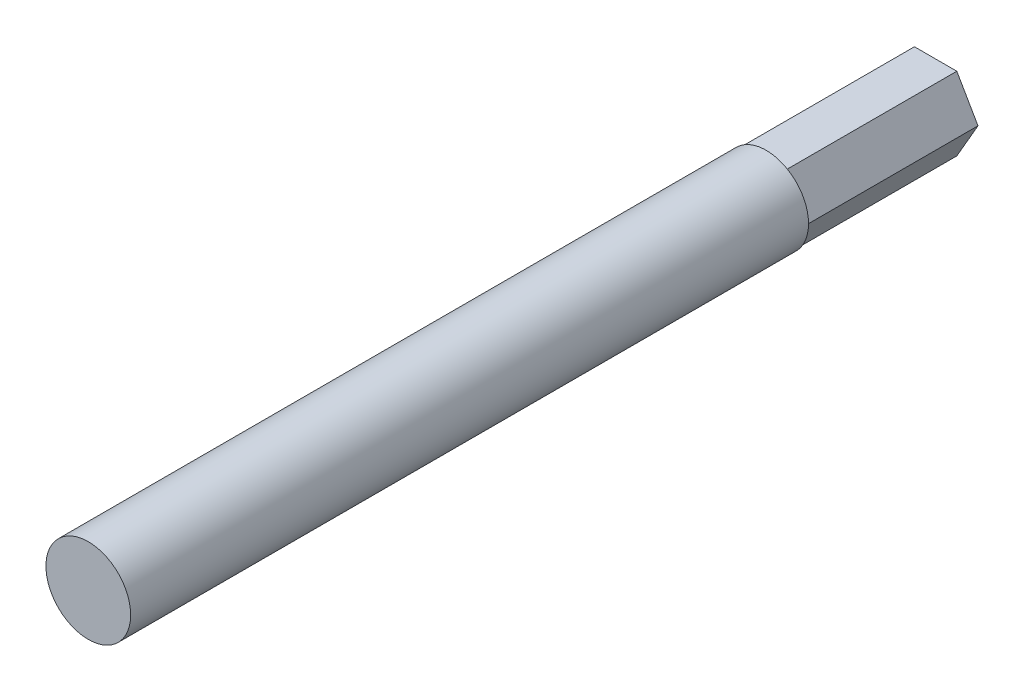
ISO-10303-21;
HEADER;
FILE_DESCRIPTION(('STEP AP214'),'2;1');
FILE_NAME('part.step','',(''),(''),'','','');
FILE_SCHEMA(('AUTOMOTIVE_DESIGN { 1 0 10303 214 1 1 1 1 }'));
ENDSEC;
DATA;
#1=APPLICATION_CONTEXT('core data for automotive mechanical design processes');
#2=APPLICATION_PROTOCOL_DEFINITION('international standard','automotive_design',2000,#1);
#3=PRODUCT_CONTEXT('',#1,'mechanical');
#4=PRODUCT('Part','Part','',(#3));
#5=PRODUCT_RELATED_PRODUCT_CATEGORY('part','',(#4));
#6=PRODUCT_DEFINITION_FORMATION('','',#4);
#7=PRODUCT_DEFINITION_CONTEXT('part definition',#1,'design');
#8=PRODUCT_DEFINITION('design','',#6,#7);
#9=PRODUCT_DEFINITION_SHAPE('','',#8);
#10=(LENGTH_UNIT() NAMED_UNIT(*) SI_UNIT(.MILLI.,.METRE.));
#11=(NAMED_UNIT(*) PLANE_ANGLE_UNIT() SI_UNIT($,.RADIAN.));
#12=(NAMED_UNIT(*) SI_UNIT($,.STERADIAN.) SOLID_ANGLE_UNIT());
#13=UNCERTAINTY_MEASURE_WITH_UNIT(LENGTH_MEASURE(1.E-05),#10,'distance_accuracy_value','');
#14=(GEOMETRIC_REPRESENTATION_CONTEXT(3) GLOBAL_UNCERTAINTY_ASSIGNED_CONTEXT((#13)) GLOBAL_UNIT_ASSIGNED_CONTEXT((#10,
#11,#12)) REPRESENTATION_CONTEXT('',''));
#15=CARTESIAN_POINT('',(0.,0.,0.));
#16=DIRECTION('',(0.,0.,1.));
#17=DIRECTION('',(1.,0.,0.));
#18=AXIS2_PLACEMENT_3D('',#15,#16,#17);
#19=CARTESIAN_POINT('',(0.,0.,-63.5));
#20=DIRECTION('',(0.,0.,1.));
#21=DIRECTION('',(1.,0.,0.));
#22=AXIS2_PLACEMENT_3D('',#19,#20,#21);
#23=CYLINDRICAL_SURFACE('',#22,6.35);
#24=CARTESIAN_POINT('',(0.,0.,63.5));
#25=DIRECTION('',(0.,0.,1.));
#26=DIRECTION('',(1.,0.,0.));
#27=AXIS2_PLACEMENT_3D('',#24,#25,#26);
#28=CIRCLE('',#27,6.35);
#29=CARTESIAN_POINT('',(6.35,0.,63.5));
#30=VERTEX_POINT('',#29);
#31=EDGE_CURVE('E11',#30,#30,#28,.T.);
#32=ORIENTED_EDGE('',*,*,#31,.F.);
#33=EDGE_LOOP('',(#32));
#34=FACE_BOUND('',#33,.T.);
#35=CARTESIAN_POINT('',(0.,0.,-38.1));
#36=DIRECTION('',(0.,0.,-1.));
#37=DIRECTION('',(-1.,0.,0.));
#38=AXIS2_PLACEMENT_3D('',#35,#36,#37);
#39=CIRCLE('',#38,6.35);
#40=CARTESIAN_POINT('',(6.35,0.,-38.1));
#41=VERTEX_POINT('',#40);
#42=CARTESIAN_POINT('',(3.175,-5.49926131403118,-38.1));
#43=VERTEX_POINT('',#42);
#44=EDGE_CURVE('E116',#41,#43,#39,.T.);
#45=ORIENTED_EDGE('',*,*,#44,.F.);
#46=CARTESIAN_POINT('',(0.,0.,-38.1));
#47=DIRECTION('',(0.,0.,-1.));
#48=DIRECTION('',(-1.,0.,0.));
#49=AXIS2_PLACEMENT_3D('',#46,#47,#48);
#50=CIRCLE('',#49,6.35);
#51=CARTESIAN_POINT('',(3.175,5.49926131403118,-38.1));
#52=VERTEX_POINT('',#51);
#53=EDGE_CURVE('E106',#52,#41,#50,.T.);
#54=ORIENTED_EDGE('',*,*,#53,.F.);
#55=CARTESIAN_POINT('',(0.,0.,-38.1));
#56=DIRECTION('',(0.,0.,-1.));
#57=DIRECTION('',(-1.,0.,0.));
#58=AXIS2_PLACEMENT_3D('',#55,#56,#57);
#59=CIRCLE('',#58,6.35);
#60=CARTESIAN_POINT('',(-3.175,5.49926131403118,-38.1));
#61=VERTEX_POINT('',#60);
#62=EDGE_CURVE('E113',#61,#52,#59,.T.);
#63=ORIENTED_EDGE('',*,*,#62,.F.);
#64=CARTESIAN_POINT('',(0.,0.,-38.1));
#65=DIRECTION('',(0.,0.,-1.));
#66=DIRECTION('',(-1.,0.,0.));
#67=AXIS2_PLACEMENT_3D('',#64,#65,#66);
#68=CIRCLE('',#67,6.35);
#69=CARTESIAN_POINT('',(-6.35,0.,-38.1));
#70=VERTEX_POINT('',#69);
#71=EDGE_CURVE('E158',#70,#61,#68,.T.);
#72=ORIENTED_EDGE('',*,*,#71,.F.);
#73=CARTESIAN_POINT('',(0.,0.,-38.1));
#74=DIRECTION('',(0.,0.,-1.));
#75=DIRECTION('',(-1.,0.,0.));
#76=AXIS2_PLACEMENT_3D('',#73,#74,#75);
#77=CIRCLE('',#76,6.35);
#78=CARTESIAN_POINT('',(-3.175,-5.49926131403118,-38.1));
#79=VERTEX_POINT('',#78);
#80=EDGE_CURVE('E135',#79,#70,#77,.T.);
#81=ORIENTED_EDGE('',*,*,#80,.F.);
#82=CARTESIAN_POINT('',(0.,0.,-38.1));
#83=DIRECTION('',(0.,0.,-1.));
#84=DIRECTION('',(-1.,0.,0.));
#85=AXIS2_PLACEMENT_3D('',#82,#83,#84);
#86=CIRCLE('',#85,6.35);
#87=EDGE_CURVE('E174',#43,#79,#86,.T.);
#88=ORIENTED_EDGE('',*,*,#87,.F.);
#89=EDGE_LOOP('',(#45,#54,#63,#72,#81,#88));
#90=FACE_BOUND('',#89,.T.);
#91=ADVANCED_FACE('F39',(#34,#90),#23,.T.);
#92=CARTESIAN_POINT('',(0.,0.,-63.5));
#93=DIRECTION('',(0.,0.,1.));
#94=DIRECTION('',(1.,0.,0.));
#95=AXIS2_PLACEMENT_3D('',#92,#93,#94);
#96=PLANE('',#95);
#97=DIRECTION('',(0.5,-0.866025403784439,0.));
#98=VECTOR('',#97,1.);
#99=CARTESIAN_POINT('',(4.7625,2.74963065701559,-63.5));
#100=LINE('',#99,#98);
#101=CARTESIAN_POINT('',(3.175,5.49926131403118,-63.5));
#102=VERTEX_POINT('',#101);
#103=CARTESIAN_POINT('',(6.35,0.,-63.5));
#104=VERTEX_POINT('',#103);
#105=EDGE_CURVE('E96',#102,#104,#100,.T.);
#106=ORIENTED_EDGE('',*,*,#105,.T.);
#107=DIRECTION('',(-0.5,-0.866025403784439,0.));
#108=VECTOR('',#107,1.);
#109=CARTESIAN_POINT('',(4.7625,-2.74963065701559,-63.5));
#110=LINE('',#109,#108);
#111=CARTESIAN_POINT('',(3.175,-5.49926131403118,-63.5));
#112=VERTEX_POINT('',#111);
#113=EDGE_CURVE('E153',#104,#112,#110,.T.);
#114=ORIENTED_EDGE('',*,*,#113,.T.);
#115=DIRECTION('',(-1.,0.,0.));
#116=VECTOR('',#115,1.);
#117=CARTESIAN_POINT('',(0.,-5.49926131403118,-63.5));
#118=LINE('',#117,#116);
#119=CARTESIAN_POINT('',(-3.175,-5.49926131403118,-63.5));
#120=VERTEX_POINT('',#119);
#121=EDGE_CURVE('E53',#112,#120,#118,.T.);
#122=ORIENTED_EDGE('',*,*,#121,.T.);
#123=DIRECTION('',(-0.5,0.866025403784439,0.));
#124=VECTOR('',#123,1.);
#125=CARTESIAN_POINT('',(-4.7625,-2.74963065701559,-63.5));
#126=LINE('',#125,#124);
#127=CARTESIAN_POINT('',(-6.35,0.,-63.5));
#128=VERTEX_POINT('',#127);
#129=EDGE_CURVE('E136',#120,#128,#126,.T.);
#130=ORIENTED_EDGE('',*,*,#129,.T.);
#131=DIRECTION('',(0.5,0.866025403784439,0.));
#132=VECTOR('',#131,1.);
#133=CARTESIAN_POINT('',(-4.7625,2.74963065701559,-63.5));
#134=LINE('',#133,#132);
#135=CARTESIAN_POINT('',(-3.175,5.49926131403118,-63.5));
#136=VERTEX_POINT('',#135);
#137=EDGE_CURVE('E61',#128,#136,#134,.T.);
#138=ORIENTED_EDGE('',*,*,#137,.T.);
#139=DIRECTION('',(1.,0.,0.));
#140=VECTOR('',#139,1.);
#141=CARTESIAN_POINT('',(0.,5.49926131403118,-63.5));
#142=LINE('',#141,#140);
#143=EDGE_CURVE('E123',#136,#102,#142,.T.);
#144=ORIENTED_EDGE('',*,*,#143,.T.);
#145=EDGE_LOOP('',(#106,#114,#122,#130,#138,#144));
#146=FACE_BOUND('',#145,.T.);
#147=ADVANCED_FACE('F151',(#146),#96,.F.);
#148=CARTESIAN_POINT('',(0.,0.,63.5));
#149=DIRECTION('',(0.,0.,1.));
#150=DIRECTION('',(1.,0.,0.));
#151=AXIS2_PLACEMENT_3D('',#148,#149,#150);
#152=PLANE('',#151);
#153=ORIENTED_EDGE('',*,*,#31,.T.);
#154=EDGE_LOOP('',(#153));
#155=FACE_BOUND('',#154,.T.);
#156=ADVANCED_FACE('F200',(#155),#152,.T.);
#157=CARTESIAN_POINT('',(0.,5.49926131403118,-38.1));
#158=DIRECTION('',(0.,1.,0.));
#159=DIRECTION('',(0.,0.,1.));
#160=AXIS2_PLACEMENT_3D('',#157,#158,#159);
#161=PLANE('',#160);
#162=ORIENTED_EDGE('',*,*,#143,.F.);
#163=DIRECTION('',(0.,0.,-1.));
#164=VECTOR('',#163,1.);
#165=CARTESIAN_POINT('',(-3.175,5.49926131403118,-38.1));
#166=LINE('',#165,#164);
#167=EDGE_CURVE('E101',#61,#136,#166,.T.);
#168=ORIENTED_EDGE('',*,*,#167,.F.);
#169=DIRECTION('',(1.,0.,0.));
#170=VECTOR('',#169,1.);
#171=CARTESIAN_POINT('',(0.,5.49926131403118,-38.1));
#172=LINE('',#171,#170);
#173=EDGE_CURVE('E120',#61,#52,#172,.T.);
#174=ORIENTED_EDGE('',*,*,#173,.T.);
#175=DIRECTION('',(0.,0.,-1.));
#176=VECTOR('',#175,1.);
#177=CARTESIAN_POINT('',(3.175,5.49926131403118,-38.1));
#178=LINE('',#177,#176);
#179=EDGE_CURVE('E46',#52,#102,#178,.T.);
#180=ORIENTED_EDGE('',*,*,#179,.T.);
#181=EDGE_LOOP('',(#162,#168,#174,#180));
#182=FACE_BOUND('',#181,.T.);
#183=ADVANCED_FACE('F121',(#182),#161,.T.);
#184=CARTESIAN_POINT('',(0.,0.,-38.1));
#185=DIRECTION('',(0.,0.,-1.));
#186=DIRECTION('',(-1.,0.,0.));
#187=AXIS2_PLACEMENT_3D('',#184,#185,#186);
#188=PLANE('',#187);
#189=ORIENTED_EDGE('',*,*,#173,.F.);
#190=ORIENTED_EDGE('',*,*,#62,.T.);
#191=EDGE_LOOP('',(#189,#190));
#192=FACE_BOUND('',#191,.T.);
#193=ADVANCED_FACE('F125',(#192),#188,.T.);
#194=CARTESIAN_POINT('',(-4.7625,-2.74963065701559,-38.1));
#195=DIRECTION('',(-0.866025403784439,-0.5,0.));
#196=DIRECTION('',(0.5,-0.866025403784439,0.));
#197=AXIS2_PLACEMENT_3D('',#194,#195,#196);
#198=PLANE('',#197);
#199=ORIENTED_EDGE('',*,*,#129,.F.);
#200=DIRECTION('',(0.,0.,-1.));
#201=VECTOR('',#200,1.);
#202=CARTESIAN_POINT('',(-3.175,-5.49926131403118,-38.1));
#203=LINE('',#202,#201);
#204=EDGE_CURVE('E130',#79,#120,#203,.T.);
#205=ORIENTED_EDGE('',*,*,#204,.F.);
#206=DIRECTION('',(-0.5,0.866025403784439,0.));
#207=VECTOR('',#206,1.);
#208=CARTESIAN_POINT('',(-4.7625,-2.74963065701559,-38.1));
#209=LINE('',#208,#207);
#210=EDGE_CURVE('E132',#79,#70,#209,.T.);
#211=ORIENTED_EDGE('',*,*,#210,.T.);
#212=DIRECTION('',(0.,0.,-1.));
#213=VECTOR('',#212,1.);
#214=CARTESIAN_POINT('',(-6.35,0.,-38.1));
#215=LINE('',#214,#213);
#216=EDGE_CURVE('E156',#70,#128,#215,.T.);
#217=ORIENTED_EDGE('',*,*,#216,.T.);
#218=EDGE_LOOP('',(#199,#205,#211,#217));
#219=FACE_BOUND('',#218,.T.);
#220=ADVANCED_FACE('F155',(#219),#198,.T.);
#221=CARTESIAN_POINT('',(0.,0.,-38.1));
#222=DIRECTION('',(0.,0.,-1.));
#223=DIRECTION('',(-1.,0.,0.));
#224=AXIS2_PLACEMENT_3D('',#221,#222,#223);
#225=PLANE('',#224);
#226=ORIENTED_EDGE('',*,*,#210,.F.);
#227=ORIENTED_EDGE('',*,*,#80,.T.);
#228=EDGE_LOOP('',(#226,#227));
#229=FACE_BOUND('',#228,.T.);
#230=ADVANCED_FACE('F183',(#229),#225,.T.);
#231=CARTESIAN_POINT('',(4.7625,-2.74963065701559,-38.1));
#232=DIRECTION('',(0.866025403784439,-0.5,0.));
#233=DIRECTION('',(0.5,0.866025403784439,0.));
#234=AXIS2_PLACEMENT_3D('',#231,#232,#233);
#235=PLANE('',#234);
#236=ORIENTED_EDGE('',*,*,#113,.F.);
#237=DIRECTION('',(0.,0.,-1.));
#238=VECTOR('',#237,1.);
#239=CARTESIAN_POINT('',(6.35,0.,-38.1));
#240=LINE('',#239,#238);
#241=EDGE_CURVE('E140',#41,#104,#240,.T.);
#242=ORIENTED_EDGE('',*,*,#241,.F.);
#243=DIRECTION('',(-0.5,-0.866025403784439,0.));
#244=VECTOR('',#243,1.);
#245=CARTESIAN_POINT('',(4.7625,-2.74963065701559,-38.1));
#246=LINE('',#245,#244);
#247=EDGE_CURVE('E160',#41,#43,#246,.T.);
#248=ORIENTED_EDGE('',*,*,#247,.T.);
#249=DIRECTION('',(0.,0.,-1.));
#250=VECTOR('',#249,1.);
#251=CARTESIAN_POINT('',(3.175,-5.49926131403118,-38.1));
#252=LINE('',#251,#250);
#253=EDGE_CURVE('E173',#43,#112,#252,.T.);
#254=ORIENTED_EDGE('',*,*,#253,.T.);
#255=EDGE_LOOP('',(#236,#242,#248,#254));
#256=FACE_BOUND('',#255,.T.);
#257=ADVANCED_FACE('F172',(#256),#235,.T.);
#258=CARTESIAN_POINT('',(0.,0.,-38.1));
#259=DIRECTION('',(0.,0.,-1.));
#260=DIRECTION('',(-1.,0.,0.));
#261=AXIS2_PLACEMENT_3D('',#258,#259,#260);
#262=PLANE('',#261);
#263=ORIENTED_EDGE('',*,*,#247,.F.);
#264=ORIENTED_EDGE('',*,*,#44,.T.);
#265=EDGE_LOOP('',(#263,#264));
#266=FACE_BOUND('',#265,.T.);
#267=ADVANCED_FACE('F190',(#266),#262,.T.);
#268=CARTESIAN_POINT('',(-4.7625,2.74963065701559,-38.1));
#269=DIRECTION('',(-0.866025403784438,0.5,0.));
#270=DIRECTION('',(-0.5,-0.866025403784439,0.));
#271=AXIS2_PLACEMENT_3D('',#268,#269,#270);
#272=PLANE('',#271);
#273=ORIENTED_EDGE('',*,*,#137,.F.);
#274=ORIENTED_EDGE('',*,*,#216,.F.);
#275=DIRECTION('',(0.5,0.866025403784439,0.));
#276=VECTOR('',#275,1.);
#277=CARTESIAN_POINT('',(-4.7625,2.74963065701559,-38.1));
#278=LINE('',#277,#276);
#279=EDGE_CURVE('E163',#70,#61,#278,.T.);
#280=ORIENTED_EDGE('',*,*,#279,.T.);
#281=ORIENTED_EDGE('',*,*,#167,.T.);
#282=EDGE_LOOP('',(#273,#274,#280,#281));
#283=FACE_BOUND('',#282,.T.);
#284=ADVANCED_FACE('F178',(#283),#272,.T.);
#285=CARTESIAN_POINT('',(0.,0.,-38.1));
#286=DIRECTION('',(0.,0.,-1.));
#287=DIRECTION('',(-1.,0.,0.));
#288=AXIS2_PLACEMENT_3D('',#285,#286,#287);
#289=PLANE('',#288);
#290=ORIENTED_EDGE('',*,*,#279,.F.);
#291=ORIENTED_EDGE('',*,*,#71,.T.);
#292=EDGE_LOOP('',(#290,#291));
#293=FACE_BOUND('',#292,.T.);
#294=ADVANCED_FACE('F180',(#293),#289,.T.);
#295=CARTESIAN_POINT('',(0.,-5.49926131403118,-38.1));
#296=DIRECTION('',(0.,-1.,0.));
#297=DIRECTION('',(0.,0.,-1.));
#298=AXIS2_PLACEMENT_3D('',#295,#296,#297);
#299=PLANE('',#298);
#300=ORIENTED_EDGE('',*,*,#121,.F.);
#301=ORIENTED_EDGE('',*,*,#253,.F.);
#302=DIRECTION('',(-1.,0.,0.));
#303=VECTOR('',#302,1.);
#304=CARTESIAN_POINT('',(0.,-5.49926131403118,-38.1));
#305=LINE('',#304,#303);
#306=EDGE_CURVE('E144',#43,#79,#305,.T.);
#307=ORIENTED_EDGE('',*,*,#306,.T.);
#308=ORIENTED_EDGE('',*,*,#204,.T.);
#309=EDGE_LOOP('',(#300,#301,#307,#308));
#310=FACE_BOUND('',#309,.T.);
#311=ADVANCED_FACE('F142',(#310),#299,.T.);
#312=CARTESIAN_POINT('',(0.,0.,-38.1));
#313=DIRECTION('',(0.,0.,-1.));
#314=DIRECTION('',(-1.,0.,0.));
#315=AXIS2_PLACEMENT_3D('',#312,#313,#314);
#316=PLANE('',#315);
#317=ORIENTED_EDGE('',*,*,#306,.F.);
#318=ORIENTED_EDGE('',*,*,#87,.T.);
#319=EDGE_LOOP('',(#317,#318));
#320=FACE_BOUND('',#319,.T.);
#321=ADVANCED_FACE('F221',(#320),#316,.T.);
#322=CARTESIAN_POINT('',(4.7625,2.74963065701559,-38.1));
#323=DIRECTION('',(0.866025403784439,0.5,0.));
#324=DIRECTION('',(-0.5,0.866025403784439,0.));
#325=AXIS2_PLACEMENT_3D('',#322,#323,#324);
#326=PLANE('',#325);
#327=ORIENTED_EDGE('',*,*,#105,.F.);
#328=ORIENTED_EDGE('',*,*,#179,.F.);
#329=DIRECTION('',(0.5,-0.866025403784439,0.));
#330=VECTOR('',#329,1.);
#331=CARTESIAN_POINT('',(4.7625,2.74963065701559,-38.1));
#332=LINE('',#331,#330);
#333=EDGE_CURVE('E93',#52,#41,#332,.T.);
#334=ORIENTED_EDGE('',*,*,#333,.T.);
#335=ORIENTED_EDGE('',*,*,#241,.T.);
#336=EDGE_LOOP('',(#327,#328,#334,#335));
#337=FACE_BOUND('',#336,.T.);
#338=ADVANCED_FACE('F92',(#337),#326,.T.);
#339=CARTESIAN_POINT('',(0.,0.,-38.1));
#340=DIRECTION('',(0.,0.,-1.));
#341=DIRECTION('',(-1.,0.,0.));
#342=AXIS2_PLACEMENT_3D('',#339,#340,#341);
#343=PLANE('',#342);
#344=ORIENTED_EDGE('',*,*,#333,.F.);
#345=ORIENTED_EDGE('',*,*,#53,.T.);
#346=EDGE_LOOP('',(#344,#345));
#347=FACE_BOUND('',#346,.T.);
#348=ADVANCED_FACE('F105',(#347),#343,.T.);
#349=CLOSED_SHELL('',(#91,#147,#156,#183,#193,#220,#230,#257,#267,#284,#294,#311,#321,#338,#348));
#350=MANIFOLD_SOLID_BREP('B2',#349);
#351=ADVANCED_BREP_SHAPE_REPRESENTATION('',(#18,#350),#14);
#352=SHAPE_DEFINITION_REPRESENTATION(#9,#351);
ENDSEC;
END-ISO-10303-21;
